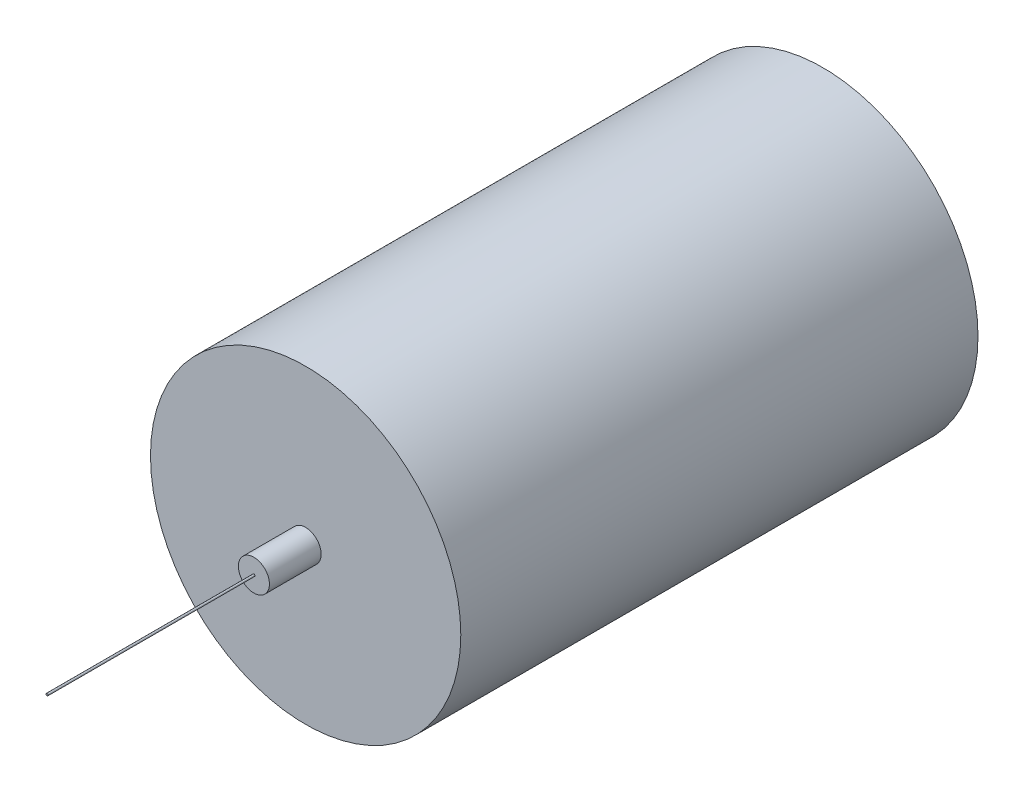
ISO-10303-21;
HEADER;
FILE_DESCRIPTION(('STEP AP214'),'2;1');
FILE_NAME('part.step','',(''),(''),'','','');
FILE_SCHEMA(('AUTOMOTIVE_DESIGN { 1 0 10303 214 1 1 1 1 }'));
ENDSEC;
DATA;
#1=APPLICATION_CONTEXT('core data for automotive mechanical design processes');
#2=APPLICATION_PROTOCOL_DEFINITION('international standard','automotive_design',2000,#1);
#3=PRODUCT_CONTEXT('',#1,'mechanical');
#4=PRODUCT('Part','Part','',(#3));
#5=PRODUCT_RELATED_PRODUCT_CATEGORY('part','',(#4));
#6=PRODUCT_DEFINITION_FORMATION('','',#4);
#7=PRODUCT_DEFINITION_CONTEXT('part definition',#1,'design');
#8=PRODUCT_DEFINITION('design','',#6,#7);
#9=PRODUCT_DEFINITION_SHAPE('','',#8);
#10=(LENGTH_UNIT() NAMED_UNIT(*) SI_UNIT(.MILLI.,.METRE.));
#11=(NAMED_UNIT(*) PLANE_ANGLE_UNIT() SI_UNIT($,.RADIAN.));
#12=(NAMED_UNIT(*) SI_UNIT($,.STERADIAN.) SOLID_ANGLE_UNIT());
#13=UNCERTAINTY_MEASURE_WITH_UNIT(LENGTH_MEASURE(1.E-05),#10,'distance_accuracy_value','');
#14=(GEOMETRIC_REPRESENTATION_CONTEXT(3) GLOBAL_UNCERTAINTY_ASSIGNED_CONTEXT((#13)) GLOBAL_UNIT_ASSIGNED_CONTEXT((#10,
#11,#12)) REPRESENTATION_CONTEXT('',''));
#15=CARTESIAN_POINT('',(0.,0.,0.));
#16=DIRECTION('',(0.,0.,1.));
#17=DIRECTION('',(1.,0.,0.));
#18=AXIS2_PLACEMENT_3D('',#15,#16,#17);
#19=CARTESIAN_POINT('',(0.,0.,5.5));
#20=DIRECTION('',(0.,0.,-1.));
#21=DIRECTION('',(-1.,0.,0.));
#22=AXIS2_PLACEMENT_3D('',#19,#20,#21);
#23=CYLINDRICAL_SURFACE('',#22,0.15);
#24=CARTESIAN_POINT('',(0.,0.,5.5));
#25=DIRECTION('',(0.,0.,1.));
#26=DIRECTION('',(1.,0.,0.));
#27=AXIS2_PLACEMENT_3D('',#24,#25,#26);
#28=CIRCLE('',#27,0.15);
#29=CARTESIAN_POINT('',(0.15,0.,5.5));
#30=VERTEX_POINT('',#29);
#31=EDGE_CURVE('E11',#30,#30,#28,.T.);
#32=ORIENTED_EDGE('',*,*,#31,.F.);
#33=EDGE_LOOP('',(#32));
#34=FACE_BOUND('',#33,.T.);
#35=CARTESIAN_POINT('',(0.,0.,5.));
#36=DIRECTION('',(0.,0.,1.));
#37=DIRECTION('',(1.,0.,0.));
#38=AXIS2_PLACEMENT_3D('',#35,#36,#37);
#39=CIRCLE('',#38,0.15);
#40=CARTESIAN_POINT('',(0.15,0.,5.));
#41=VERTEX_POINT('',#40);
#42=EDGE_CURVE('E42',#41,#41,#39,.T.);
#43=ORIENTED_EDGE('',*,*,#42,.T.);
#44=EDGE_LOOP('',(#43));
#45=FACE_BOUND('',#44,.T.);
#46=ADVANCED_FACE('F39',(#34,#45),#23,.T.);
#47=CARTESIAN_POINT('',(0.,0.,5.5));
#48=DIRECTION('',(0.,0.,1.));
#49=DIRECTION('',(1.,0.,0.));
#50=AXIS2_PLACEMENT_3D('',#47,#48,#49);
#51=PLANE('',#50);
#52=CARTESIAN_POINT('',(0.,0.,5.5));
#53=DIRECTION('',(0.,0.,1.));
#54=DIRECTION('',(1.,0.,0.));
#55=AXIS2_PLACEMENT_3D('',#52,#53,#54);
#56=CIRCLE('',#55,0.01);
#57=CARTESIAN_POINT('',(0.01,0.,5.5));
#58=VERTEX_POINT('',#57);
#59=EDGE_CURVE('E51',#58,#58,#56,.T.);
#60=ORIENTED_EDGE('',*,*,#59,.F.);
#61=EDGE_LOOP('',(#60));
#62=FACE_BOUND('',#61,.T.);
#63=ORIENTED_EDGE('',*,*,#31,.T.);
#64=EDGE_LOOP('',(#63));
#65=FACE_BOUND('',#64,.T.);
#66=ADVANCED_FACE('F66',(#62,#65),#51,.T.);
#67=CARTESIAN_POINT('',(0.,0.,5.));
#68=DIRECTION('',(0.,0.,1.));
#69=DIRECTION('',(1.,0.,0.));
#70=AXIS2_PLACEMENT_3D('',#67,#68,#69);
#71=PLANE('',#70);
#72=ORIENTED_EDGE('',*,*,#42,.F.);
#73=EDGE_LOOP('',(#72));
#74=FACE_BOUND('',#73,.T.);
#75=ADVANCED_FACE('F62',(#74),#71,.F.);
#76=CARTESIAN_POINT('',(0.,0.,7.5));
#77=DIRECTION('',(0.,0.,-1.));
#78=DIRECTION('',(-1.,0.,0.));
#79=AXIS2_PLACEMENT_3D('',#76,#77,#78);
#80=CYLINDRICAL_SURFACE('',#79,0.01);
#81=CARTESIAN_POINT('',(0.,0.,7.5));
#82=DIRECTION('',(0.,0.,1.));
#83=DIRECTION('',(1.,0.,0.));
#84=AXIS2_PLACEMENT_3D('',#81,#82,#83);
#85=CIRCLE('',#84,0.01);
#86=CARTESIAN_POINT('',(0.01,0.,7.5));
#87=VERTEX_POINT('',#86);
#88=EDGE_CURVE('E49',#87,#87,#85,.T.);
#89=ORIENTED_EDGE('',*,*,#88,.F.);
#90=EDGE_LOOP('',(#89));
#91=FACE_BOUND('',#90,.T.);
#92=ORIENTED_EDGE('',*,*,#59,.T.);
#93=EDGE_LOOP('',(#92));
#94=FACE_BOUND('',#93,.T.);
#95=ADVANCED_FACE('F59',(#91,#94),#80,.T.);
#96=CARTESIAN_POINT('',(0.,0.,7.5));
#97=DIRECTION('',(0.,0.,1.));
#98=DIRECTION('',(1.,0.,0.));
#99=AXIS2_PLACEMENT_3D('',#96,#97,#98);
#100=PLANE('',#99);
#101=ORIENTED_EDGE('',*,*,#88,.T.);
#102=EDGE_LOOP('',(#101));
#103=FACE_BOUND('',#102,.T.);
#104=ADVANCED_FACE('F57',(#103),#100,.T.);
#105=CLOSED_SHELL('',(#46,#66,#75,#95,#104));
#106=MANIFOLD_SOLID_BREP('B2',#105);
#107=CARTESIAN_POINT('',(0.,0.,0.));
#108=DIRECTION('',(0.,0.,1.));
#109=DIRECTION('',(1.,0.,0.));
#110=AXIS2_PLACEMENT_3D('',#107,#108,#109);
#111=PLANE('',#110);
#112=CARTESIAN_POINT('',(0.,0.,0.));
#113=DIRECTION('',(0.,0.,1.));
#114=DIRECTION('',(1.,0.,0.));
#115=AXIS2_PLACEMENT_3D('',#112,#113,#114);
#116=CIRCLE('',#115,1.5);
#117=CARTESIAN_POINT('',(1.5,0.,0.));
#118=VERTEX_POINT('',#117);
#119=EDGE_CURVE('E38',#118,#118,#116,.T.);
#120=ORIENTED_EDGE('',*,*,#119,.F.);
#121=EDGE_LOOP('',(#120));
#122=FACE_BOUND('',#121,.T.);
#123=CARTESIAN_POINT('',(0.,0.,0.));
#124=DIRECTION('',(0.,0.,1.));
#125=DIRECTION('',(1.,0.,0.));
#126=AXIS2_PLACEMENT_3D('',#123,#124,#125);
#127=CIRCLE('',#126,0.5);
#128=CARTESIAN_POINT('',(0.5,0.,0.));
#129=VERTEX_POINT('',#128);
#130=EDGE_CURVE('E117',#129,#129,#127,.T.);
#131=ORIENTED_EDGE('',*,*,#130,.T.);
#132=EDGE_LOOP('',(#131));
#133=FACE_BOUND('',#132,.T.);
#134=ADVANCED_FACE('F110',(#122,#133),#111,.F.);
#135=CARTESIAN_POINT('',(0.,0.,4.));
#136=DIRECTION('',(0.,0.,-1.));
#137=DIRECTION('',(-1.,0.,0.));
#138=AXIS2_PLACEMENT_3D('',#135,#136,#137);
#139=CYLINDRICAL_SURFACE('',#138,1.5);
#140=ORIENTED_EDGE('',*,*,#119,.T.);
#141=EDGE_LOOP('',(#140));
#142=FACE_BOUND('',#141,.T.);
#143=CARTESIAN_POINT('',(0.,0.,5.));
#144=DIRECTION('',(0.,0.,1.));
#145=DIRECTION('',(1.,0.,0.));
#146=AXIS2_PLACEMENT_3D('',#143,#144,#145);
#147=CIRCLE('',#146,1.5);
#148=CARTESIAN_POINT('',(1.5,0.,5.));
#149=VERTEX_POINT('',#148);
#150=EDGE_CURVE('E125',#149,#149,#147,.T.);
#151=ORIENTED_EDGE('',*,*,#150,.F.);
#152=EDGE_LOOP('',(#151));
#153=FACE_BOUND('',#152,.T.);
#154=ADVANCED_FACE('F112',(#142,#153),#139,.T.);
#155=CARTESIAN_POINT('',(0.,0.,4.));
#156=DIRECTION('',(0.,0.,-1.));
#157=DIRECTION('',(-1.,0.,0.));
#158=AXIS2_PLACEMENT_3D('',#155,#156,#157);
#159=CYLINDRICAL_SURFACE('',#158,0.5);
#160=CARTESIAN_POINT('',(0.,0.,4.));
#161=DIRECTION('',(0.,0.,1.));
#162=DIRECTION('',(1.,0.,0.));
#163=AXIS2_PLACEMENT_3D('',#160,#161,#162);
#164=CIRCLE('',#163,0.5);
#165=CARTESIAN_POINT('',(0.5,0.,4.));
#166=VERTEX_POINT('',#165);
#167=EDGE_CURVE('E121',#166,#166,#164,.T.);
#168=ORIENTED_EDGE('',*,*,#167,.T.);
#169=EDGE_LOOP('',(#168));
#170=FACE_BOUND('',#169,.T.);
#171=ORIENTED_EDGE('',*,*,#130,.F.);
#172=EDGE_LOOP('',(#171));
#173=FACE_BOUND('',#172,.T.);
#174=ADVANCED_FACE('F150',(#170,#173),#159,.F.);
#175=CARTESIAN_POINT('',(0.,0.,4.));
#176=DIRECTION('',(0.,0.,1.));
#177=DIRECTION('',(1.,0.,0.));
#178=AXIS2_PLACEMENT_3D('',#175,#176,#177);
#179=PLANE('',#178);
#180=CARTESIAN_POINT('',(0.,0.,4.));
#181=DIRECTION('',(0.,0.,1.));
#182=DIRECTION('',(1.,0.,0.));
#183=AXIS2_PLACEMENT_3D('',#180,#181,#182);
#184=CIRCLE('',#183,0.15);
#185=CARTESIAN_POINT('',(0.15,0.,4.));
#186=VERTEX_POINT('',#185);
#187=EDGE_CURVE('E131',#186,#186,#184,.T.);
#188=ORIENTED_EDGE('',*,*,#187,.T.);
#189=EDGE_LOOP('',(#188));
#190=FACE_BOUND('',#189,.T.);
#191=ORIENTED_EDGE('',*,*,#167,.F.);
#192=EDGE_LOOP('',(#191));
#193=FACE_BOUND('',#192,.T.);
#194=ADVANCED_FACE('F142',(#190,#193),#179,.F.);
#195=CARTESIAN_POINT('',(0.,0.,5.));
#196=DIRECTION('',(0.,0.,1.));
#197=DIRECTION('',(1.,0.,0.));
#198=AXIS2_PLACEMENT_3D('',#195,#196,#197);
#199=PLANE('',#198);
#200=ORIENTED_EDGE('',*,*,#150,.T.);
#201=EDGE_LOOP('',(#200));
#202=FACE_BOUND('',#201,.T.);
#203=CARTESIAN_POINT('',(0.,0.,5.));
#204=DIRECTION('',(0.,0.,1.));
#205=DIRECTION('',(1.,0.,0.));
#206=AXIS2_PLACEMENT_3D('',#203,#204,#205);
#207=CIRCLE('',#206,0.15);
#208=CARTESIAN_POINT('',(0.15,0.,5.));
#209=VERTEX_POINT('',#208);
#210=EDGE_CURVE('E130',#209,#209,#207,.T.);
#211=ORIENTED_EDGE('',*,*,#210,.F.);
#212=EDGE_LOOP('',(#211));
#213=FACE_BOUND('',#212,.T.);
#214=ADVANCED_FACE('F140',(#202,#213),#199,.T.);
#215=CARTESIAN_POINT('',(0.,0.,5.));
#216=DIRECTION('',(0.,0.,-1.));
#217=DIRECTION('',(-1.,0.,0.));
#218=AXIS2_PLACEMENT_3D('',#215,#216,#217);
#219=CYLINDRICAL_SURFACE('',#218,0.15);
#220=ORIENTED_EDGE('',*,*,#210,.T.);
#221=EDGE_LOOP('',(#220));
#222=FACE_BOUND('',#221,.T.);
#223=ORIENTED_EDGE('',*,*,#187,.F.);
#224=EDGE_LOOP('',(#223));
#225=FACE_BOUND('',#224,.T.);
#226=ADVANCED_FACE('F137',(#222,#225),#219,.F.);
#227=CLOSED_SHELL('',(#134,#154,#174,#194,#214,#226));
#228=MANIFOLD_SOLID_BREP('B6',#227);
#229=ADVANCED_BREP_SHAPE_REPRESENTATION('',(#18,#106,#228),#14);
#230=SHAPE_DEFINITION_REPRESENTATION(#9,#229);
ENDSEC;
END-ISO-10303-21;
